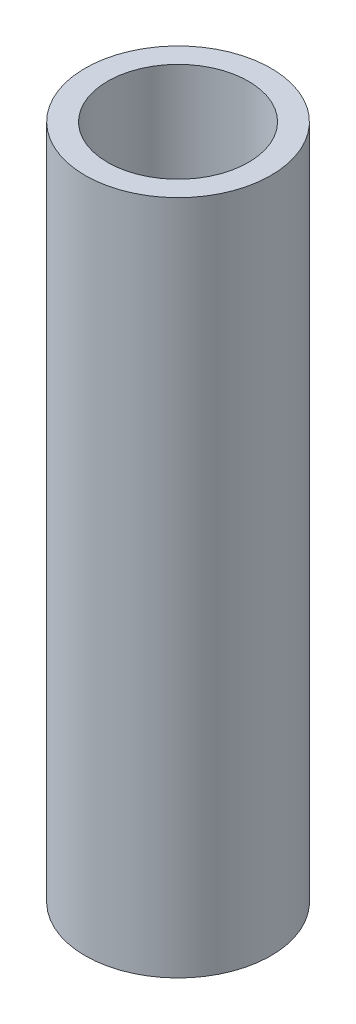
ISO-10303-21;
HEADER;
FILE_DESCRIPTION(('STEP AP214'),'2;1');
FILE_NAME('part.step','',(''),(''),'','','');
FILE_SCHEMA(('AUTOMOTIVE_DESIGN { 1 0 10303 214 1 1 1 1 }'));
ENDSEC;
DATA;
#1=APPLICATION_CONTEXT('core data for automotive mechanical design processes');
#2=APPLICATION_PROTOCOL_DEFINITION('international standard','automotive_design',2000,#1);
#3=PRODUCT_CONTEXT('',#1,'mechanical');
#4=PRODUCT('Part','Part','',(#3));
#5=PRODUCT_RELATED_PRODUCT_CATEGORY('part','',(#4));
#6=PRODUCT_DEFINITION_FORMATION('','',#4);
#7=PRODUCT_DEFINITION_CONTEXT('part definition',#1,'design');
#8=PRODUCT_DEFINITION('design','',#6,#7);
#9=PRODUCT_DEFINITION_SHAPE('','',#8);
#10=(LENGTH_UNIT() NAMED_UNIT(*) SI_UNIT(.MILLI.,.METRE.));
#11=(NAMED_UNIT(*) PLANE_ANGLE_UNIT() SI_UNIT($,.RADIAN.));
#12=(NAMED_UNIT(*) SI_UNIT($,.STERADIAN.) SOLID_ANGLE_UNIT());
#13=UNCERTAINTY_MEASURE_WITH_UNIT(LENGTH_MEASURE(1.E-05),#10,'distance_accuracy_value','');
#14=(GEOMETRIC_REPRESENTATION_CONTEXT(3) GLOBAL_UNCERTAINTY_ASSIGNED_CONTEXT((#13)) GLOBAL_UNIT_ASSIGNED_CONTEXT((#10,
#11,#12)) REPRESENTATION_CONTEXT('',''));
#15=CARTESIAN_POINT('',(0.,0.,0.));
#16=DIRECTION('',(0.,0.,1.));
#17=DIRECTION('',(1.,0.,0.));
#18=AXIS2_PLACEMENT_3D('',#15,#16,#17);
#19=CARTESIAN_POINT('',(0.,6.,0.));
#20=DIRECTION('',(0.,1.,0.));
#21=DIRECTION('',(0.,0.,1.));
#22=AXIS2_PLACEMENT_3D('',#19,#20,#21);
#23=PLANE('',#22);
#24=CARTESIAN_POINT('',(0.,6.,0.));
#25=DIRECTION('',(0.,1.,0.));
#26=DIRECTION('',(0.,0.,1.));
#27=AXIS2_PLACEMENT_3D('',#24,#25,#26);
#28=CIRCLE('',#27,0.824999999999999);
#29=CARTESIAN_POINT('',(0.,6.,0.824999999999999));
#30=VERTEX_POINT('',#29);
#31=EDGE_CURVE('E11',#30,#30,#28,.T.);
#32=ORIENTED_EDGE('',*,*,#31,.T.);
#33=EDGE_LOOP('',(#32));
#34=FACE_BOUND('',#33,.T.);
#35=CARTESIAN_POINT('',(0.,6.,0.));
#36=DIRECTION('',(0.,1.,0.));
#37=DIRECTION('',(0.,0.,1.));
#38=AXIS2_PLACEMENT_3D('',#35,#36,#37);
#39=CIRCLE('',#38,0.625);
#40=CARTESIAN_POINT('',(0.,6.,0.625));
#41=VERTEX_POINT('',#40);
#42=EDGE_CURVE('E48',#41,#41,#39,.T.);
#43=ORIENTED_EDGE('',*,*,#42,.F.);
#44=EDGE_LOOP('',(#43));
#45=FACE_BOUND('',#44,.T.);
#46=ADVANCED_FACE('F37',(#34,#45),#23,.T.);
#47=CARTESIAN_POINT('',(0.,0.,0.));
#48=DIRECTION('',(0.,1.,0.));
#49=DIRECTION('',(0.,0.,1.));
#50=AXIS2_PLACEMENT_3D('',#47,#48,#49);
#51=PLANE('',#50);
#52=CARTESIAN_POINT('',(0.,0.,0.));
#53=DIRECTION('',(0.,1.,0.));
#54=DIRECTION('',(0.,0.,1.));
#55=AXIS2_PLACEMENT_3D('',#52,#53,#54);
#56=CIRCLE('',#55,0.824999999999999);
#57=CARTESIAN_POINT('',(0.,0.,0.824999999999999));
#58=VERTEX_POINT('',#57);
#59=EDGE_CURVE('E41',#58,#58,#56,.T.);
#60=ORIENTED_EDGE('',*,*,#59,.F.);
#61=EDGE_LOOP('',(#60));
#62=FACE_BOUND('',#61,.T.);
#63=CARTESIAN_POINT('',(0.,0.,0.));
#64=DIRECTION('',(0.,1.,0.));
#65=DIRECTION('',(0.,0.,1.));
#66=AXIS2_PLACEMENT_3D('',#63,#64,#65);
#67=CIRCLE('',#66,0.625);
#68=CARTESIAN_POINT('',(0.,0.,0.625));
#69=VERTEX_POINT('',#68);
#70=EDGE_CURVE('E50',#69,#69,#67,.T.);
#71=ORIENTED_EDGE('',*,*,#70,.T.);
#72=EDGE_LOOP('',(#71));
#73=FACE_BOUND('',#72,.T.);
#74=ADVANCED_FACE('F60',(#62,#73),#51,.F.);
#75=CARTESIAN_POINT('',(0.,6.,0.));
#76=DIRECTION('',(0.,-1.,0.));
#77=DIRECTION('',(0.,0.,-1.));
#78=AXIS2_PLACEMENT_3D('',#75,#76,#77);
#79=CYLINDRICAL_SURFACE('',#78,0.824999999999999);
#80=ORIENTED_EDGE('',*,*,#31,.F.);
#81=EDGE_LOOP('',(#80));
#82=FACE_BOUND('',#81,.T.);
#83=ORIENTED_EDGE('',*,*,#59,.T.);
#84=EDGE_LOOP('',(#83));
#85=FACE_BOUND('',#84,.T.);
#86=ADVANCED_FACE('F39',(#82,#85),#79,.T.);
#87=CARTESIAN_POINT('',(0.,6.,0.));
#88=DIRECTION('',(0.,-1.,0.));
#89=DIRECTION('',(0.,0.,-1.));
#90=AXIS2_PLACEMENT_3D('',#87,#88,#89);
#91=CYLINDRICAL_SURFACE('',#90,0.625);
#92=ORIENTED_EDGE('',*,*,#42,.T.);
#93=EDGE_LOOP('',(#92));
#94=FACE_BOUND('',#93,.T.);
#95=ORIENTED_EDGE('',*,*,#70,.F.);
#96=EDGE_LOOP('',(#95));
#97=FACE_BOUND('',#96,.T.);
#98=ADVANCED_FACE('F56',(#94,#97),#91,.F.);
#99=CLOSED_SHELL('',(#46,#74,#86,#98));
#100=MANIFOLD_SOLID_BREP('B2',#99);
#101=ADVANCED_BREP_SHAPE_REPRESENTATION('',(#18,#100),#14);
#102=SHAPE_DEFINITION_REPRESENTATION(#9,#101);
ENDSEC;
END-ISO-10303-21;
